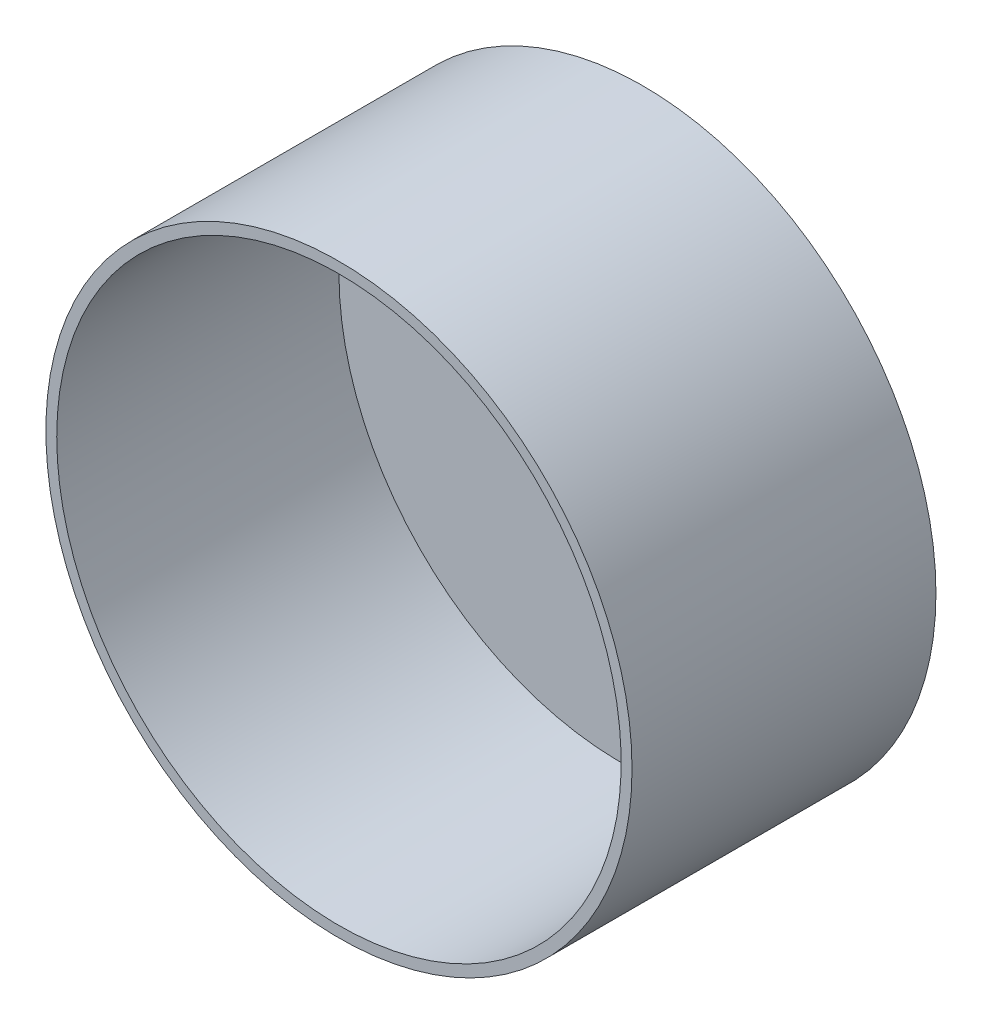
ISO-10303-21;
HEADER;
FILE_DESCRIPTION(('STEP AP214'),'2;1');
FILE_NAME('part.step','',(''),(''),'','','');
FILE_SCHEMA(('AUTOMOTIVE_DESIGN { 1 0 10303 214 1 1 1 1 }'));
ENDSEC;
DATA;
#1=APPLICATION_CONTEXT('core data for automotive mechanical design processes');
#2=APPLICATION_PROTOCOL_DEFINITION('international standard','automotive_design',2000,#1);
#3=PRODUCT_CONTEXT('',#1,'mechanical');
#4=PRODUCT('Part','Part','',(#3));
#5=PRODUCT_RELATED_PRODUCT_CATEGORY('part','',(#4));
#6=PRODUCT_DEFINITION_FORMATION('','',#4);
#7=PRODUCT_DEFINITION_CONTEXT('part definition',#1,'design');
#8=PRODUCT_DEFINITION('design','',#6,#7);
#9=PRODUCT_DEFINITION_SHAPE('','',#8);
#10=(LENGTH_UNIT() NAMED_UNIT(*) SI_UNIT(.MILLI.,.METRE.));
#11=(NAMED_UNIT(*) PLANE_ANGLE_UNIT() SI_UNIT($,.RADIAN.));
#12=(NAMED_UNIT(*) SI_UNIT($,.STERADIAN.) SOLID_ANGLE_UNIT());
#13=UNCERTAINTY_MEASURE_WITH_UNIT(LENGTH_MEASURE(1.E-05),#10,'distance_accuracy_value','');
#14=(GEOMETRIC_REPRESENTATION_CONTEXT(3) GLOBAL_UNCERTAINTY_ASSIGNED_CONTEXT((#13)) GLOBAL_UNIT_ASSIGNED_CONTEXT((#10,
#11,#12)) REPRESENTATION_CONTEXT('',''));
#15=CARTESIAN_POINT('',(0.,0.,0.));
#16=DIRECTION('',(0.,0.,1.));
#17=DIRECTION('',(1.,0.,0.));
#18=AXIS2_PLACEMENT_3D('',#15,#16,#17);
#19=CARTESIAN_POINT('',(0.,0.,1.));
#20=DIRECTION('',(0.,0.,-1.));
#21=DIRECTION('',(-1.,0.,0.));
#22=AXIS2_PLACEMENT_3D('',#19,#20,#21);
#23=CYLINDRICAL_SURFACE('',#22,13.5);
#24=CARTESIAN_POINT('',(0.,0.,0.));
#25=DIRECTION('',(0.,0.,1.));
#26=DIRECTION('',(1.,0.,0.));
#27=AXIS2_PLACEMENT_3D('',#24,#25,#26);
#28=CIRCLE('',#27,13.5);
#29=CARTESIAN_POINT('',(13.5,0.,0.));
#30=VERTEX_POINT('',#29);
#31=EDGE_CURVE('E50',#30,#30,#28,.T.);
#32=ORIENTED_EDGE('',*,*,#31,.T.);
#33=EDGE_LOOP('',(#32));
#34=FACE_BOUND('',#33,.T.);
#35=CARTESIAN_POINT('',(0.,0.,14.));
#36=DIRECTION('',(0.,0.,1.));
#37=DIRECTION('',(1.,0.,0.));
#38=AXIS2_PLACEMENT_3D('',#35,#36,#37);
#39=CIRCLE('',#38,13.5);
#40=CARTESIAN_POINT('',(13.5,0.,14.));
#41=VERTEX_POINT('',#40);
#42=EDGE_CURVE('E55',#41,#41,#39,.T.);
#43=ORIENTED_EDGE('',*,*,#42,.F.);
#44=EDGE_LOOP('',(#43));
#45=FACE_BOUND('',#44,.T.);
#46=ADVANCED_FACE('F43',(#34,#45),#23,.T.);
#47=CARTESIAN_POINT('',(0.,0.,0.));
#48=DIRECTION('',(0.,0.,1.));
#49=DIRECTION('',(1.,0.,0.));
#50=AXIS2_PLACEMENT_3D('',#47,#48,#49);
#51=PLANE('',#50);
#52=ORIENTED_EDGE('',*,*,#31,.F.);
#53=EDGE_LOOP('',(#52));
#54=FACE_BOUND('',#53,.T.);
#55=ADVANCED_FACE('F71',(#54),#51,.F.);
#56=CARTESIAN_POINT('',(0.,0.,14.));
#57=DIRECTION('',(0.,0.,1.));
#58=DIRECTION('',(1.,0.,0.));
#59=AXIS2_PLACEMENT_3D('',#56,#57,#58);
#60=PLANE('',#59);
#61=ORIENTED_EDGE('',*,*,#42,.T.);
#62=EDGE_LOOP('',(#61));
#63=FACE_BOUND('',#62,.T.);
#64=CARTESIAN_POINT('',(0.,0.,14.));
#65=DIRECTION('',(0.,0.,1.));
#66=DIRECTION('',(1.,0.,0.));
#67=AXIS2_PLACEMENT_3D('',#64,#65,#66);
#68=CIRCLE('',#67,13.);
#69=CARTESIAN_POINT('',(-13.,0.,14.));
#70=VERTEX_POINT('',#69);
#71=EDGE_CURVE('E60',#70,#70,#68,.T.);
#72=ORIENTED_EDGE('',*,*,#71,.F.);
#73=EDGE_LOOP('',(#72));
#74=FACE_BOUND('',#73,.T.);
#75=ADVANCED_FACE('F69',(#63,#74),#60,.T.);
#76=CARTESIAN_POINT('',(0.,0.,14.));
#77=DIRECTION('',(0.,0.,-1.));
#78=DIRECTION('',(-1.,0.,0.));
#79=AXIS2_PLACEMENT_3D('',#76,#77,#78);
#80=CYLINDRICAL_SURFACE('',#79,13.);
#81=CARTESIAN_POINT('',(0.,0.,1.));
#82=DIRECTION('',(0.,0.,1.));
#83=DIRECTION('',(1.,0.,0.));
#84=AXIS2_PLACEMENT_3D('',#81,#82,#83);
#85=CIRCLE('',#84,13.);
#86=CARTESIAN_POINT('',(-13.,0.,0.999999999999999));
#87=VERTEX_POINT('',#86);
#88=EDGE_CURVE('E10',#87,#87,#85,.F.);
#89=CARTESIAN_POINT('',(-13.,0.,14.));
#90=CARTESIAN_POINT('',(-13.,0.,13.8645833333333));
#91=CARTESIAN_POINT('',(-13.,0.,13.7291666666667));
#92=CARTESIAN_POINT('',(-13.,0.,13.4583333333333));
#93=CARTESIAN_POINT('',(-13.,0.,13.3229166666667));
#94=CARTESIAN_POINT('',(-13.,0.,13.0520833333333));
#95=CARTESIAN_POINT('',(-13.,0.,12.9166666666667));
#96=CARTESIAN_POINT('',(-13.,0.,12.6458333333333));
#97=CARTESIAN_POINT('',(-13.,0.,12.5104166666667));
#98=CARTESIAN_POINT('',(-13.,0.,12.2395833333333));
#99=CARTESIAN_POINT('',(-13.,0.,12.1041666666667));
#100=CARTESIAN_POINT('',(-13.,0.,11.8333333333333));
#101=CARTESIAN_POINT('',(-13.,0.,11.6979166666667));
#102=CARTESIAN_POINT('',(-13.,0.,11.4270833333333));
#103=CARTESIAN_POINT('',(-13.,0.,11.2916666666667));
#104=CARTESIAN_POINT('',(-13.,0.,11.0208333333333));
#105=CARTESIAN_POINT('',(-13.,0.,10.8854166666667));
#106=CARTESIAN_POINT('',(-13.,0.,10.6145833333333));
#107=CARTESIAN_POINT('',(-13.,0.,10.4791666666667));
#108=CARTESIAN_POINT('',(-13.,0.,10.2083333333333));
#109=CARTESIAN_POINT('',(-13.,0.,10.0729166666667));
#110=CARTESIAN_POINT('',(-13.,0.,9.80208333333333));
#111=CARTESIAN_POINT('',(-13.,0.,9.66666666666667));
#112=CARTESIAN_POINT('',(-13.,0.,9.39583333333333));
#113=CARTESIAN_POINT('',(-13.,0.,9.26041666666666));
#114=CARTESIAN_POINT('',(-13.,0.,8.98958333333333));
#115=CARTESIAN_POINT('',(-13.,0.,8.85416666666666));
#116=CARTESIAN_POINT('',(-13.,0.,8.58333333333333));
#117=CARTESIAN_POINT('',(-13.,0.,8.44791666666667));
#118=CARTESIAN_POINT('',(-13.,0.,8.17708333333333));
#119=CARTESIAN_POINT('',(-13.,0.,8.04166666666667));
#120=CARTESIAN_POINT('',(-13.,0.,7.77083333333333));
#121=CARTESIAN_POINT('',(-13.,0.,7.63541666666667));
#122=CARTESIAN_POINT('',(-13.,0.,7.36458333333333));
#123=CARTESIAN_POINT('',(-13.,0.,7.22916666666667));
#124=CARTESIAN_POINT('',(-13.,0.,6.95833333333333));
#125=CARTESIAN_POINT('',(-13.,0.,6.82291666666667));
#126=CARTESIAN_POINT('',(-13.,0.,6.55208333333333));
#127=CARTESIAN_POINT('',(-13.,0.,6.41666666666667));
#128=CARTESIAN_POINT('',(-13.,0.,6.14583333333333));
#129=CARTESIAN_POINT('',(-13.,0.,6.01041666666667));
#130=CARTESIAN_POINT('',(-13.,0.,5.73958333333333));
#131=CARTESIAN_POINT('',(-13.,0.,5.60416666666667));
#132=CARTESIAN_POINT('',(-13.,0.,5.33333333333333));
#133=CARTESIAN_POINT('',(-13.,0.,5.19791666666667));
#134=CARTESIAN_POINT('',(-13.,0.,4.92708333333333));
#135=CARTESIAN_POINT('',(-13.,0.,4.79166666666667));
#136=CARTESIAN_POINT('',(-13.,0.,4.52083333333333));
#137=CARTESIAN_POINT('',(-13.,0.,4.38541666666667));
#138=CARTESIAN_POINT('',(-13.,0.,4.11458333333333));
#139=CARTESIAN_POINT('',(-13.,0.,3.97916666666666));
#140=CARTESIAN_POINT('',(-13.,0.,3.70833333333333));
#141=CARTESIAN_POINT('',(-13.,0.,3.57291666666667));
#142=CARTESIAN_POINT('',(-13.,0.,3.30208333333333));
#143=CARTESIAN_POINT('',(-13.,0.,3.16666666666667));
#144=CARTESIAN_POINT('',(-13.,0.,2.89583333333333));
#145=CARTESIAN_POINT('',(-13.,0.,2.76041666666667));
#146=CARTESIAN_POINT('',(-13.,0.,2.48958333333333));
#147=CARTESIAN_POINT('',(-13.,0.,2.35416666666667));
#148=CARTESIAN_POINT('',(-13.,0.,2.08333333333333));
#149=CARTESIAN_POINT('',(-13.,0.,1.94791666666667));
#150=CARTESIAN_POINT('',(-13.,0.,1.67708333333333));
#151=CARTESIAN_POINT('',(-13.,0.,1.54166666666667));
#152=CARTESIAN_POINT('',(-13.,0.,1.27083333333333));
#153=CARTESIAN_POINT('',(-13.,0.,1.13541666666667));
#154=CARTESIAN_POINT('',(-13.,0.,0.999999999999999));
#155=B_SPLINE_CURVE_WITH_KNOTS('',3,(#89,#90,#91,#92,#93,#94,#95,#96,#97,#98,#99,#100,#101,#102,
#103,#104,#105,#106,#107,#108,#109,#110,#111,#112,#113,#114,#115,#116,#117,#118,#119,#120,#121,
#122,#123,#124,#125,#126,#127,#128,#129,#130,#131,#132,#133,#134,#135,#136,#137,#138,#139,#140,
#141,#142,#143,#144,#145,#146,#147,#148,#149,#150,#151,#152,#153,#154),.UNSPECIFIED.,.F.,.F.,(4,
2,2,2,2,2,2,2,2,2,2,2,2,2,2,2,2,2,2,2,2,2,2,2,2,2,2,2,2,2,2,2,4),(0.,0.406249999999999,
0.812499999999999,1.21875,1.625,2.03125,2.4375,2.84375,3.25,3.65625,4.0625,4.46875,4.875,
5.28125,5.6875,6.09375,6.5,6.90625,7.3125,7.71875,8.125,8.53125,8.9375,9.34375,9.75,10.15625,
10.5625,10.96875,11.375,11.78125,12.1875,12.59375,13.),.UNSPECIFIED.);
#156=EDGE_CURVE('BSEAM67',#70,#87,#155,.T.);
#157=ORIENTED_EDGE('',*,*,#71,.T.);
#158=ORIENTED_EDGE('',*,*,#88,.T.);
#159=ORIENTED_EDGE('',*,*,#156,.T.);
#160=ORIENTED_EDGE('',*,*,#156,.F.);
#161=EDGE_LOOP('',(#157,#159,#158,#160));
#162=FACE_BOUND('',#161,.T.);
#163=ADVANCED_FACE('F67',(#162),#80,.F.);
#164=CARTESIAN_POINT('',(0.,0.,1.));
#165=DIRECTION('',(0.,0.,1.));
#166=DIRECTION('',(1.,0.,0.));
#167=AXIS2_PLACEMENT_3D('',#164,#165,#166);
#168=PLANE('',#167);
#169=ORIENTED_EDGE('',*,*,#88,.F.);
#170=EDGE_LOOP('',(#169));
#171=FACE_BOUND('',#170,.T.);
#172=ADVANCED_FACE('F78',(#171),#168,.T.);
#173=CLOSED_SHELL('',(#46,#55,#75,#163,#172));
#174=MANIFOLD_SOLID_BREP('B2',#173);
#175=ADVANCED_BREP_SHAPE_REPRESENTATION('',(#18,#174),#14);
#176=SHAPE_DEFINITION_REPRESENTATION(#9,#175);
ENDSEC;
END-ISO-10303-21;
